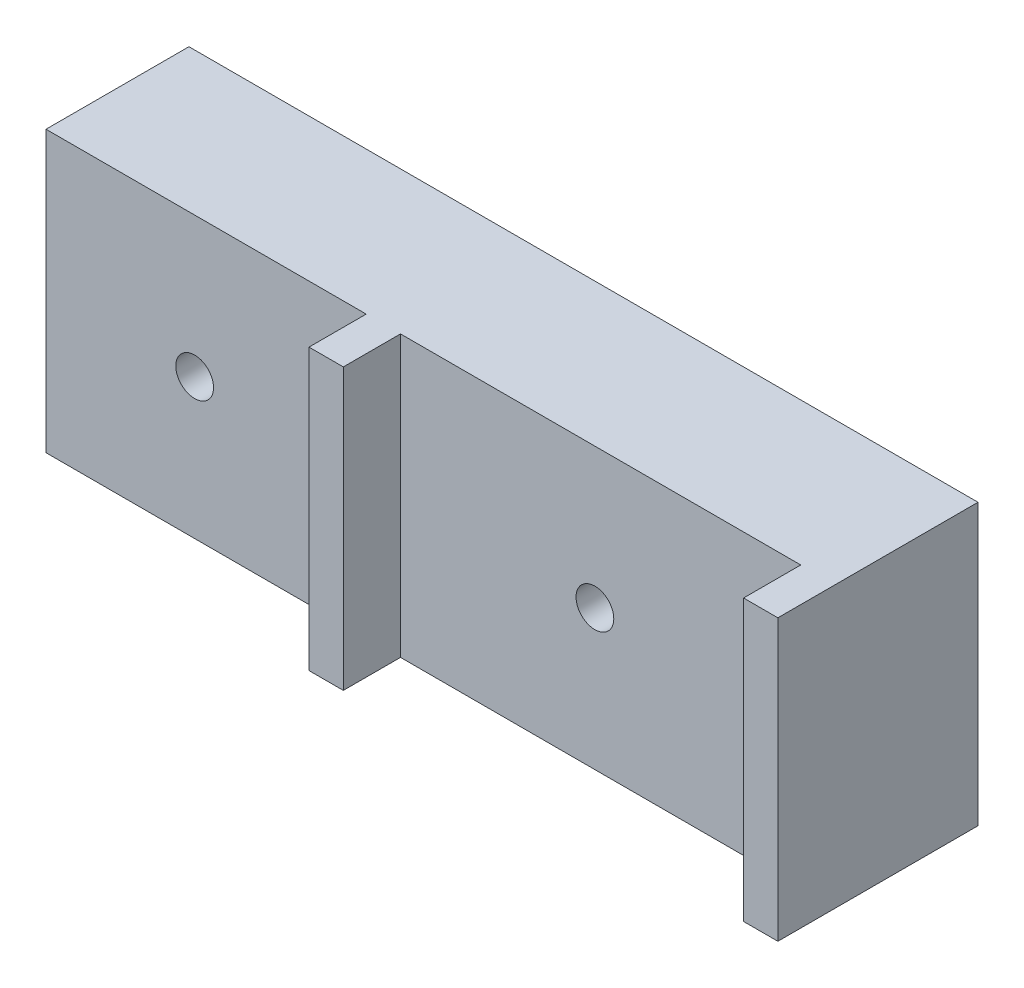
ISO-10303-21;
HEADER;
FILE_DESCRIPTION(('STEP AP214'),'2;1');
FILE_NAME('part.step','',(''),(''),'','','');
FILE_SCHEMA(('AUTOMOTIVE_DESIGN { 1 0 10303 214 1 1 1 1 }'));
ENDSEC;
DATA;
#1=APPLICATION_CONTEXT('core data for automotive mechanical design processes');
#2=APPLICATION_PROTOCOL_DEFINITION('international standard','automotive_design',2000,#1);
#3=PRODUCT_CONTEXT('',#1,'mechanical');
#4=PRODUCT('Part','Part','',(#3));
#5=PRODUCT_RELATED_PRODUCT_CATEGORY('part','',(#4));
#6=PRODUCT_DEFINITION_FORMATION('','',#4);
#7=PRODUCT_DEFINITION_CONTEXT('part definition',#1,'design');
#8=PRODUCT_DEFINITION('design','',#6,#7);
#9=PRODUCT_DEFINITION_SHAPE('','',#8);
#10=(LENGTH_UNIT() NAMED_UNIT(*) SI_UNIT(.MILLI.,.METRE.));
#11=(NAMED_UNIT(*) PLANE_ANGLE_UNIT() SI_UNIT($,.RADIAN.));
#12=(NAMED_UNIT(*) SI_UNIT($,.STERADIAN.) SOLID_ANGLE_UNIT());
#13=UNCERTAINTY_MEASURE_WITH_UNIT(LENGTH_MEASURE(1.E-05),#10,'distance_accuracy_value','');
#14=(GEOMETRIC_REPRESENTATION_CONTEXT(3) GLOBAL_UNCERTAINTY_ASSIGNED_CONTEXT((#13)) GLOBAL_UNIT_ASSIGNED_CONTEXT((#10,
#11,#12)) REPRESENTATION_CONTEXT('',''));
#15=CARTESIAN_POINT('',(0.,0.,0.));
#16=DIRECTION('',(0.,0.,1.));
#17=DIRECTION('',(1.,0.,0.));
#18=AXIS2_PLACEMENT_3D('',#15,#16,#17);
#19=CARTESIAN_POINT('',(0.,0.,12.5));
#20=DIRECTION('',(0.,0.,-1.));
#21=DIRECTION('',(-1.,0.,0.));
#22=AXIS2_PLACEMENT_3D('',#19,#20,#21);
#23=PLANE('',#22);
#24=CARTESIAN_POINT('',(-21.5,0.,12.5));
#25=DIRECTION('',(0.,0.,1.));
#26=DIRECTION('',(1.,0.,0.));
#27=AXIS2_PLACEMENT_3D('',#24,#25,#26);
#28=CIRCLE('',#27,1.65);
#29=CARTESIAN_POINT('',(-19.85,0.,12.5));
#30=VERTEX_POINT('',#29);
#31=EDGE_CURVE('E167',#30,#30,#28,.T.);
#32=ORIENTED_EDGE('',*,*,#31,.F.);
#33=EDGE_LOOP('',(#32));
#34=FACE_BOUND('',#33,.T.);
#35=DIRECTION('',(0.,-1.,0.));
#36=VECTOR('',#35,1.);
#37=CARTESIAN_POINT('',(-6.5,12.25,12.5));
#38=LINE('',#37,#36);
#39=CARTESIAN_POINT('',(-6.5,12.25,12.5));
#40=VERTEX_POINT('',#39);
#41=CARTESIAN_POINT('',(-6.5,-12.25,12.5));
#42=VERTEX_POINT('',#41);
#43=EDGE_CURVE('E52',#40,#42,#38,.T.);
#44=ORIENTED_EDGE('',*,*,#43,.F.);
#45=DIRECTION('',(-1.,0.,0.));
#46=VECTOR('',#45,1.);
#47=CARTESIAN_POINT('',(-34.5,12.25,12.5));
#48=LINE('',#47,#46);
#49=CARTESIAN_POINT('',(-34.5,12.25,12.5));
#50=VERTEX_POINT('',#49);
#51=EDGE_CURVE('E177',#40,#50,#48,.T.);
#52=ORIENTED_EDGE('',*,*,#51,.T.);
#53=DIRECTION('',(0.,-1.,0.));
#54=VECTOR('',#53,1.);
#55=CARTESIAN_POINT('',(-34.5,-12.25,12.5));
#56=LINE('',#55,#54);
#57=CARTESIAN_POINT('',(-34.5,-12.25,12.5));
#58=VERTEX_POINT('',#57);
#59=EDGE_CURVE('E176',#50,#58,#56,.T.);
#60=ORIENTED_EDGE('',*,*,#59,.T.);
#61=DIRECTION('',(1.,0.,0.));
#62=VECTOR('',#61,1.);
#63=CARTESIAN_POINT('',(-34.5,-12.25,12.5));
#64=LINE('',#63,#62);
#65=EDGE_CURVE('E180',#58,#42,#64,.T.);
#66=ORIENTED_EDGE('',*,*,#65,.T.);
#67=EDGE_LOOP('',(#44,#52,#60,#66));
#68=FACE_BOUND('',#67,.T.);
#69=ADVANCED_FACE('F37',(#34,#68),#23,.F.);
#70=CARTESIAN_POINT('',(13.5,0.,12.5));
#71=DIRECTION('',(0.,0.,1.));
#72=DIRECTION('',(1.,0.,0.));
#73=AXIS2_PLACEMENT_3D('',#70,#71,#72);
#74=CIRCLE('',#73,1.65);
#75=CARTESIAN_POINT('',(15.15,0.,12.5));
#76=VERTEX_POINT('',#75);
#77=EDGE_CURVE('E162',#76,#76,#74,.T.);
#78=ORIENTED_EDGE('',*,*,#77,.F.);
#79=EDGE_LOOP('',(#78));
#80=FACE_BOUND('',#79,.T.);
#81=DIRECTION('',(0.,1.,0.));
#82=VECTOR('',#81,1.);
#83=CARTESIAN_POINT('',(-3.5,12.25,12.5));
#84=LINE('',#83,#82);
#85=CARTESIAN_POINT('',(-3.5,-12.25,12.5));
#86=VERTEX_POINT('',#85);
#87=CARTESIAN_POINT('',(-3.5,12.25,12.5));
#88=VERTEX_POINT('',#87);
#89=EDGE_CURVE('E135',#86,#88,#84,.T.);
#90=ORIENTED_EDGE('',*,*,#89,.F.);
#91=CARTESIAN_POINT('',(31.5,-12.25,12.5));
#92=VERTEX_POINT('',#91);
#93=EDGE_CURVE('E179',#86,#92,#64,.T.);
#94=ORIENTED_EDGE('',*,*,#93,.T.);
#95=DIRECTION('',(0.,-1.,0.));
#96=VECTOR('',#95,1.);
#97=CARTESIAN_POINT('',(31.5,12.25,12.5));
#98=LINE('',#97,#96);
#99=CARTESIAN_POINT('',(31.5,12.25,12.5));
#100=VERTEX_POINT('',#99);
#101=EDGE_CURVE('E138',#100,#92,#98,.T.);
#102=ORIENTED_EDGE('',*,*,#101,.F.);
#103=EDGE_CURVE('E60',#100,#88,#48,.T.);
#104=ORIENTED_EDGE('',*,*,#103,.T.);
#105=EDGE_LOOP('',(#90,#94,#102,#104));
#106=FACE_BOUND('',#105,.T.);
#107=ADVANCED_FACE('F218',(#80,#106),#23,.F.);
#108=CARTESIAN_POINT('',(34.5,-12.25,12.5));
#109=DIRECTION('',(-1.,0.,0.));
#110=DIRECTION('',(0.,0.,1.));
#111=AXIS2_PLACEMENT_3D('',#108,#109,#110);
#112=PLANE('',#111);
#113=DIRECTION('',(0.,1.,0.));
#114=VECTOR('',#113,1.);
#115=CARTESIAN_POINT('',(34.5,-12.25,0.));
#116=LINE('',#115,#114);
#117=CARTESIAN_POINT('',(34.5,-12.25,0.));
#118=VERTEX_POINT('',#117);
#119=CARTESIAN_POINT('',(34.5,12.25,0.));
#120=VERTEX_POINT('',#119);
#121=EDGE_CURVE('E166',#118,#120,#116,.T.);
#122=ORIENTED_EDGE('',*,*,#121,.T.);
#123=DIRECTION('',(0.,0.,-1.));
#124=VECTOR('',#123,1.);
#125=CARTESIAN_POINT('',(34.5,12.25,12.5));
#126=LINE('',#125,#124);
#127=CARTESIAN_POINT('',(34.5,12.25,17.5));
#128=VERTEX_POINT('',#127);
#129=EDGE_CURVE('E11',#128,#120,#126,.T.);
#130=ORIENTED_EDGE('',*,*,#129,.F.);
#131=DIRECTION('',(0.,1.,0.));
#132=VECTOR('',#131,1.);
#133=CARTESIAN_POINT('',(34.5,12.25,17.5));
#134=LINE('',#133,#132);
#135=CARTESIAN_POINT('',(34.5,-12.25,17.5));
#136=VERTEX_POINT('',#135);
#137=EDGE_CURVE('E141',#136,#128,#134,.T.);
#138=ORIENTED_EDGE('',*,*,#137,.F.);
#139=DIRECTION('',(0.,0.,-1.));
#140=VECTOR('',#139,1.);
#141=CARTESIAN_POINT('',(34.5,-12.25,12.5));
#142=LINE('',#141,#140);
#143=EDGE_CURVE('E182',#136,#118,#142,.T.);
#144=ORIENTED_EDGE('',*,*,#143,.T.);
#145=EDGE_LOOP('',(#122,#130,#138,#144));
#146=FACE_BOUND('',#145,.T.);
#147=ADVANCED_FACE('F39',(#146),#112,.F.);
#148=CARTESIAN_POINT('',(-34.5,12.25,12.5));
#149=DIRECTION('',(0.,-1.,0.));
#150=DIRECTION('',(0.,0.,-1.));
#151=AXIS2_PLACEMENT_3D('',#148,#149,#150);
#152=PLANE('',#151);
#153=DIRECTION('',(-1.,0.,0.));
#154=VECTOR('',#153,1.);
#155=CARTESIAN_POINT('',(-34.5,12.25,0.));
#156=LINE('',#155,#154);
#157=CARTESIAN_POINT('',(-34.5,12.25,0.));
#158=VERTEX_POINT('',#157);
#159=EDGE_CURVE('E185',#120,#158,#156,.T.);
#160=ORIENTED_EDGE('',*,*,#159,.T.);
#161=DIRECTION('',(0.,0.,-1.));
#162=VECTOR('',#161,1.);
#163=CARTESIAN_POINT('',(-34.5,12.25,12.5));
#164=LINE('',#163,#162);
#165=EDGE_CURVE('E45',#50,#158,#164,.T.);
#166=ORIENTED_EDGE('',*,*,#165,.F.);
#167=ORIENTED_EDGE('',*,*,#51,.F.);
#168=DIRECTION('',(0.,0.,-1.));
#169=VECTOR('',#168,1.);
#170=CARTESIAN_POINT('',(-6.5,12.25,17.5));
#171=LINE('',#170,#169);
#172=CARTESIAN_POINT('',(-6.5,12.25,17.5));
#173=VERTEX_POINT('',#172);
#174=EDGE_CURVE('E223',#173,#40,#171,.T.);
#175=ORIENTED_EDGE('',*,*,#174,.F.);
#176=DIRECTION('',(-1.,0.,0.));
#177=VECTOR('',#176,1.);
#178=CARTESIAN_POINT('',(-6.5,12.25,17.5));
#179=LINE('',#178,#177);
#180=CARTESIAN_POINT('',(-3.5,12.25,17.5));
#181=VERTEX_POINT('',#180);
#182=EDGE_CURVE('E131',#181,#173,#179,.T.);
#183=ORIENTED_EDGE('',*,*,#182,.F.);
#184=DIRECTION('',(0.,0.,-1.));
#185=VECTOR('',#184,1.);
#186=CARTESIAN_POINT('',(-3.5,12.25,17.5));
#187=LINE('',#186,#185);
#188=EDGE_CURVE('E143',#181,#88,#187,.T.);
#189=ORIENTED_EDGE('',*,*,#188,.T.);
#190=ORIENTED_EDGE('',*,*,#103,.F.);
#191=DIRECTION('',(0.,0.,-1.));
#192=VECTOR('',#191,1.);
#193=CARTESIAN_POINT('',(31.5,12.25,17.5));
#194=LINE('',#193,#192);
#195=CARTESIAN_POINT('',(31.5,12.25,17.5));
#196=VERTEX_POINT('',#195);
#197=EDGE_CURVE('E159',#196,#100,#194,.T.);
#198=ORIENTED_EDGE('',*,*,#197,.F.);
#199=DIRECTION('',(-1.,0.,0.));
#200=VECTOR('',#199,1.);
#201=CARTESIAN_POINT('',(34.5,12.25,17.5));
#202=LINE('',#201,#200);
#203=EDGE_CURVE('E149',#128,#196,#202,.T.);
#204=ORIENTED_EDGE('',*,*,#203,.F.);
#205=ORIENTED_EDGE('',*,*,#129,.T.);
#206=EDGE_LOOP('',(#160,#166,#167,#175,#183,#189,#190,#198,#204,#205));
#207=FACE_BOUND('',#206,.T.);
#208=ADVANCED_FACE('F220',(#207),#152,.F.);
#209=CARTESIAN_POINT('',(-34.5,-12.25,12.5));
#210=DIRECTION('',(1.,0.,0.));
#211=DIRECTION('',(0.,0.,-1.));
#212=AXIS2_PLACEMENT_3D('',#209,#210,#211);
#213=PLANE('',#212);
#214=DIRECTION('',(0.,-1.,0.));
#215=VECTOR('',#214,1.);
#216=CARTESIAN_POINT('',(-34.5,-12.25,0.));
#217=LINE('',#216,#215);
#218=CARTESIAN_POINT('',(-34.5,-12.25,0.));
#219=VERTEX_POINT('',#218);
#220=EDGE_CURVE('E187',#158,#219,#217,.T.);
#221=ORIENTED_EDGE('',*,*,#220,.T.);
#222=DIRECTION('',(0.,0.,-1.));
#223=VECTOR('',#222,1.);
#224=CARTESIAN_POINT('',(-34.5,-12.25,12.5));
#225=LINE('',#224,#223);
#226=EDGE_CURVE('E193',#58,#219,#225,.T.);
#227=ORIENTED_EDGE('',*,*,#226,.F.);
#228=ORIENTED_EDGE('',*,*,#59,.F.);
#229=ORIENTED_EDGE('',*,*,#165,.T.);
#230=EDGE_LOOP('',(#221,#227,#228,#229));
#231=FACE_BOUND('',#230,.T.);
#232=ADVANCED_FACE('F200',(#231),#213,.F.);
#233=CARTESIAN_POINT('',(-34.5,-12.25,12.5));
#234=DIRECTION('',(0.,1.,0.));
#235=DIRECTION('',(0.,0.,1.));
#236=AXIS2_PLACEMENT_3D('',#233,#234,#235);
#237=PLANE('',#236);
#238=DIRECTION('',(1.,0.,0.));
#239=VECTOR('',#238,1.);
#240=CARTESIAN_POINT('',(-34.5,-12.25,0.));
#241=LINE('',#240,#239);
#242=EDGE_CURVE('E189',#219,#118,#241,.T.);
#243=ORIENTED_EDGE('',*,*,#242,.T.);
#244=ORIENTED_EDGE('',*,*,#143,.F.);
#245=DIRECTION('',(1.,0.,0.));
#246=VECTOR('',#245,1.);
#247=CARTESIAN_POINT('',(34.5,-12.25,17.5));
#248=LINE('',#247,#246);
#249=CARTESIAN_POINT('',(31.5,-12.25,17.5));
#250=VERTEX_POINT('',#249);
#251=EDGE_CURVE('E153',#250,#136,#248,.T.);
#252=ORIENTED_EDGE('',*,*,#251,.F.);
#253=DIRECTION('',(0.,0.,-1.));
#254=VECTOR('',#253,1.);
#255=CARTESIAN_POINT('',(31.5,-12.25,17.5));
#256=LINE('',#255,#254);
#257=EDGE_CURVE('E155',#250,#92,#256,.T.);
#258=ORIENTED_EDGE('',*,*,#257,.T.);
#259=ORIENTED_EDGE('',*,*,#93,.F.);
#260=DIRECTION('',(0.,0.,-1.));
#261=VECTOR('',#260,1.);
#262=CARTESIAN_POINT('',(-3.5,-12.25,17.5));
#263=LINE('',#262,#261);
#264=CARTESIAN_POINT('',(-3.5,-12.25,17.5));
#265=VERTEX_POINT('',#264);
#266=EDGE_CURVE('E122',#265,#86,#263,.T.);
#267=ORIENTED_EDGE('',*,*,#266,.F.);
#268=DIRECTION('',(1.,0.,0.));
#269=VECTOR('',#268,1.);
#270=CARTESIAN_POINT('',(-6.5,-12.25,17.5));
#271=LINE('',#270,#269);
#272=CARTESIAN_POINT('',(-6.5,-12.25,17.5));
#273=VERTEX_POINT('',#272);
#274=EDGE_CURVE('E115',#273,#265,#271,.T.);
#275=ORIENTED_EDGE('',*,*,#274,.F.);
#276=DIRECTION('',(0.,0.,-1.));
#277=VECTOR('',#276,1.);
#278=CARTESIAN_POINT('',(-6.5,-12.25,17.5));
#279=LINE('',#278,#277);
#280=EDGE_CURVE('E120',#273,#42,#279,.T.);
#281=ORIENTED_EDGE('',*,*,#280,.T.);
#282=ORIENTED_EDGE('',*,*,#65,.F.);
#283=ORIENTED_EDGE('',*,*,#226,.T.);
#284=EDGE_LOOP('',(#243,#244,#252,#258,#259,#267,#275,#281,#282,#283));
#285=FACE_BOUND('',#284,.T.);
#286=ADVANCED_FACE('F117',(#285),#237,.F.);
#287=CARTESIAN_POINT('',(0.,0.,0.));
#288=DIRECTION('',(0.,0.,-1.));
#289=DIRECTION('',(-1.,0.,0.));
#290=AXIS2_PLACEMENT_3D('',#287,#288,#289);
#291=PLANE('',#290);
#292=CARTESIAN_POINT('',(-21.5,0.,0.));
#293=DIRECTION('',(0.,0.,1.));
#294=DIRECTION('',(1.,0.,0.));
#295=AXIS2_PLACEMENT_3D('',#292,#293,#294);
#296=CIRCLE('',#295,1.65);
#297=CARTESIAN_POINT('',(-19.85,0.,0.));
#298=VERTEX_POINT('',#297);
#299=EDGE_CURVE('E163',#298,#298,#296,.T.);
#300=ORIENTED_EDGE('',*,*,#299,.T.);
#301=EDGE_LOOP('',(#300));
#302=FACE_BOUND('',#301,.T.);
#303=CARTESIAN_POINT('',(13.5,0.,0.));
#304=DIRECTION('',(0.,0.,1.));
#305=DIRECTION('',(1.,0.,0.));
#306=AXIS2_PLACEMENT_3D('',#303,#304,#305);
#307=CIRCLE('',#306,1.65);
#308=CARTESIAN_POINT('',(15.15,0.,0.));
#309=VERTEX_POINT('',#308);
#310=EDGE_CURVE('E170',#309,#309,#307,.T.);
#311=ORIENTED_EDGE('',*,*,#310,.T.);
#312=EDGE_LOOP('',(#311));
#313=FACE_BOUND('',#312,.T.);
#314=ORIENTED_EDGE('',*,*,#121,.F.);
#315=ORIENTED_EDGE('',*,*,#242,.F.);
#316=ORIENTED_EDGE('',*,*,#220,.F.);
#317=ORIENTED_EDGE('',*,*,#159,.F.);
#318=EDGE_LOOP('',(#314,#315,#316,#317));
#319=FACE_BOUND('',#318,.T.);
#320=ADVANCED_FACE('F206',(#302,#313,#319),#291,.T.);
#321=CARTESIAN_POINT('',(13.5,0.,0.));
#322=DIRECTION('',(0.,0.,1.));
#323=DIRECTION('',(1.,0.,0.));
#324=AXIS2_PLACEMENT_3D('',#321,#322,#323);
#325=CYLINDRICAL_SURFACE('',#324,1.65);
#326=ORIENTED_EDGE('',*,*,#310,.F.);
#327=EDGE_LOOP('',(#326));
#328=FACE_BOUND('',#327,.T.);
#329=ORIENTED_EDGE('',*,*,#77,.T.);
#330=EDGE_LOOP('',(#329));
#331=FACE_BOUND('',#330,.T.);
#332=ADVANCED_FACE('F248',(#328,#331),#325,.F.);
#333=CARTESIAN_POINT('',(-21.5,0.,0.));
#334=DIRECTION('',(0.,0.,1.));
#335=DIRECTION('',(1.,0.,0.));
#336=AXIS2_PLACEMENT_3D('',#333,#334,#335);
#337=CYLINDRICAL_SURFACE('',#336,1.65);
#338=ORIENTED_EDGE('',*,*,#299,.F.);
#339=EDGE_LOOP('',(#338));
#340=FACE_BOUND('',#339,.T.);
#341=ORIENTED_EDGE('',*,*,#31,.T.);
#342=EDGE_LOOP('',(#341));
#343=FACE_BOUND('',#342,.T.);
#344=ADVANCED_FACE('F276',(#340,#343),#337,.F.);
#345=CARTESIAN_POINT('',(31.5,12.25,17.5));
#346=DIRECTION('',(1.,0.,0.));
#347=DIRECTION('',(0.,0.,-1.));
#348=AXIS2_PLACEMENT_3D('',#345,#346,#347);
#349=PLANE('',#348);
#350=ORIENTED_EDGE('',*,*,#101,.T.);
#351=ORIENTED_EDGE('',*,*,#257,.F.);
#352=DIRECTION('',(0.,-1.,0.));
#353=VECTOR('',#352,1.);
#354=CARTESIAN_POINT('',(31.5,12.25,17.5));
#355=LINE('',#354,#353);
#356=EDGE_CURVE('E151',#196,#250,#355,.T.);
#357=ORIENTED_EDGE('',*,*,#356,.F.);
#358=ORIENTED_EDGE('',*,*,#197,.T.);
#359=EDGE_LOOP('',(#350,#351,#357,#358));
#360=FACE_BOUND('',#359,.T.);
#361=ADVANCED_FACE('F217',(#360),#349,.F.);
#362=CARTESIAN_POINT('',(0.,0.,17.5));
#363=DIRECTION('',(0.,0.,-1.));
#364=DIRECTION('',(-1.,0.,0.));
#365=AXIS2_PLACEMENT_3D('',#362,#363,#364);
#366=PLANE('',#365);
#367=ORIENTED_EDGE('',*,*,#137,.T.);
#368=ORIENTED_EDGE('',*,*,#203,.T.);
#369=ORIENTED_EDGE('',*,*,#356,.T.);
#370=ORIENTED_EDGE('',*,*,#251,.T.);
#371=EDGE_LOOP('',(#367,#368,#369,#370));
#372=FACE_BOUND('',#371,.T.);
#373=ADVANCED_FACE('F212',(#372),#366,.F.);
#374=CARTESIAN_POINT('',(-6.5,12.25,17.5));
#375=DIRECTION('',(1.,0.,0.));
#376=DIRECTION('',(0.,1.,0.));
#377=AXIS2_PLACEMENT_3D('',#374,#375,#376);
#378=PLANE('',#377);
#379=ORIENTED_EDGE('',*,*,#43,.T.);
#380=ORIENTED_EDGE('',*,*,#280,.F.);
#381=DIRECTION('',(0.,-1.,0.));
#382=VECTOR('',#381,1.);
#383=CARTESIAN_POINT('',(-6.5,12.25,17.5));
#384=LINE('',#383,#382);
#385=EDGE_CURVE('E126',#173,#273,#384,.T.);
#386=ORIENTED_EDGE('',*,*,#385,.F.);
#387=ORIENTED_EDGE('',*,*,#174,.T.);
#388=EDGE_LOOP('',(#379,#380,#386,#387));
#389=FACE_BOUND('',#388,.T.);
#390=ADVANCED_FACE('F137',(#389),#378,.F.);
#391=CARTESIAN_POINT('',(-3.5,12.25,17.5));
#392=DIRECTION('',(-1.,0.,0.));
#393=DIRECTION('',(0.,-1.,0.));
#394=AXIS2_PLACEMENT_3D('',#391,#392,#393);
#395=PLANE('',#394);
#396=ORIENTED_EDGE('',*,*,#89,.T.);
#397=ORIENTED_EDGE('',*,*,#188,.F.);
#398=DIRECTION('',(0.,1.,0.));
#399=VECTOR('',#398,1.);
#400=CARTESIAN_POINT('',(-3.5,12.25,17.5));
#401=LINE('',#400,#399);
#402=EDGE_CURVE('E125',#265,#181,#401,.T.);
#403=ORIENTED_EDGE('',*,*,#402,.F.);
#404=ORIENTED_EDGE('',*,*,#266,.T.);
#405=EDGE_LOOP('',(#396,#397,#403,#404));
#406=FACE_BOUND('',#405,.T.);
#407=ADVANCED_FACE('F229',(#406),#395,.F.);
#408=CARTESIAN_POINT('',(0.,0.,17.5));
#409=DIRECTION('',(0.,0.,1.));
#410=DIRECTION('',(1.,0.,0.));
#411=AXIS2_PLACEMENT_3D('',#408,#409,#410);
#412=PLANE('',#411);
#413=ORIENTED_EDGE('',*,*,#385,.T.);
#414=ORIENTED_EDGE('',*,*,#274,.T.);
#415=ORIENTED_EDGE('',*,*,#402,.T.);
#416=ORIENTED_EDGE('',*,*,#182,.T.);
#417=EDGE_LOOP('',(#413,#414,#415,#416));
#418=FACE_BOUND('',#417,.T.);
#419=ADVANCED_FACE('F129',(#418),#412,.T.);
#420=CLOSED_SHELL('',(#69,#107,#147,#208,#232,#286,#320,#332,#344,#361,#373,#390,#407,#419));
#421=MANIFOLD_SOLID_BREP('B2',#420);
#422=ADVANCED_BREP_SHAPE_REPRESENTATION('',(#18,#421),#14);
#423=SHAPE_DEFINITION_REPRESENTATION(#9,#422);
ENDSEC;
END-ISO-10303-21;
